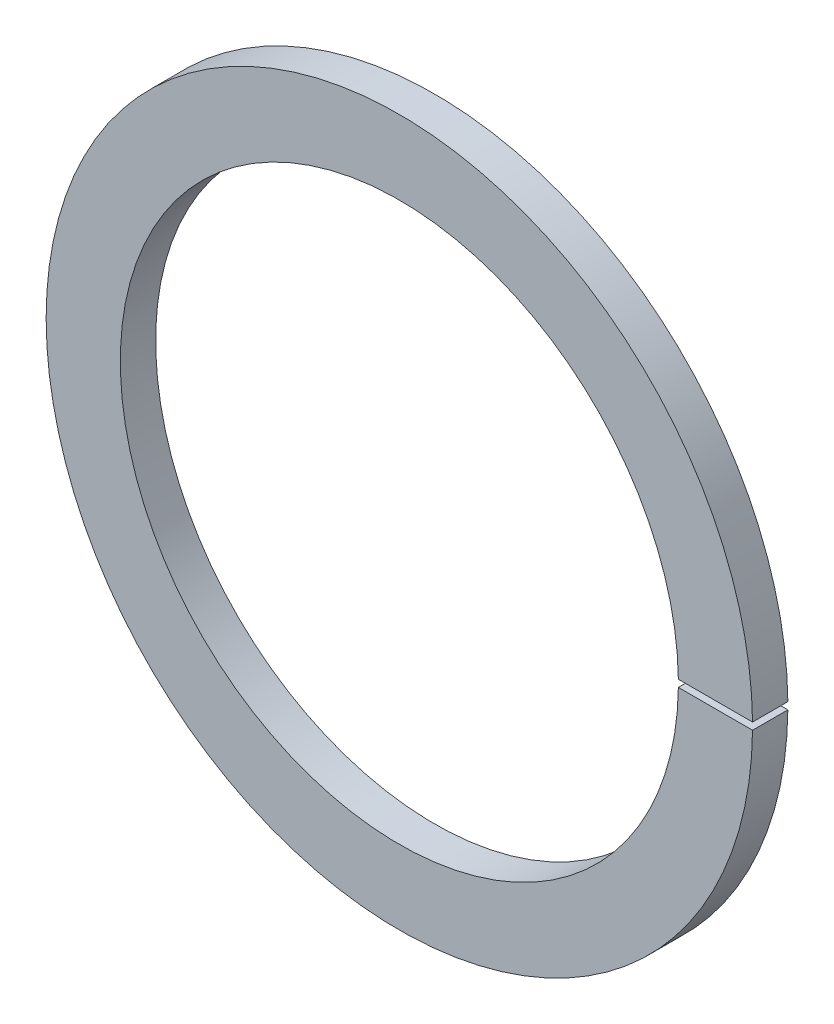
ISO-10303-21;
HEADER;
FILE_DESCRIPTION(('STEP AP214'),'2;1');
FILE_NAME('part.step','',(''),(''),'','','');
FILE_SCHEMA(('AUTOMOTIVE_DESIGN { 1 0 10303 214 1 1 1 1 }'));
ENDSEC;
DATA;
#1=APPLICATION_CONTEXT('core data for automotive mechanical design processes');
#2=APPLICATION_PROTOCOL_DEFINITION('international standard','automotive_design',2000,#1);
#3=PRODUCT_CONTEXT('',#1,'mechanical');
#4=PRODUCT('Part','Part','',(#3));
#5=PRODUCT_RELATED_PRODUCT_CATEGORY('part','',(#4));
#6=PRODUCT_DEFINITION_FORMATION('','',#4);
#7=PRODUCT_DEFINITION_CONTEXT('part definition',#1,'design');
#8=PRODUCT_DEFINITION('design','',#6,#7);
#9=PRODUCT_DEFINITION_SHAPE('','',#8);
#10=(LENGTH_UNIT() NAMED_UNIT(*) SI_UNIT(.MILLI.,.METRE.));
#11=(NAMED_UNIT(*) PLANE_ANGLE_UNIT() SI_UNIT($,.RADIAN.));
#12=(NAMED_UNIT(*) SI_UNIT($,.STERADIAN.) SOLID_ANGLE_UNIT());
#13=UNCERTAINTY_MEASURE_WITH_UNIT(LENGTH_MEASURE(1.E-05),#10,'distance_accuracy_value','');
#14=(GEOMETRIC_REPRESENTATION_CONTEXT(3) GLOBAL_UNCERTAINTY_ASSIGNED_CONTEXT((#13)) GLOBAL_UNIT_ASSIGNED_CONTEXT((#10,
#11,#12)) REPRESENTATION_CONTEXT('',''));
#15=CARTESIAN_POINT('',(0.,0.,0.));
#16=DIRECTION('',(0.,0.,1.));
#17=DIRECTION('',(1.,0.,0.));
#18=AXIS2_PLACEMENT_3D('',#15,#16,#17);
#19=CARTESIAN_POINT('',(0.,0.,1.));
#20=DIRECTION('',(0.,0.,-1.));
#21=DIRECTION('',(-1.,0.,0.));
#22=AXIS2_PLACEMENT_3D('',#19,#20,#21);
#23=CYLINDRICAL_SURFACE('',#22,10.);
#24=CARTESIAN_POINT('',(0.,0.,0.));
#25=DIRECTION('',(0.,0.,1.));
#26=DIRECTION('',(1.,0.,0.));
#27=AXIS2_PLACEMENT_3D('',#24,#25,#26);
#28=CIRCLE('',#27,10.);
#29=CARTESIAN_POINT('',(9.99949998749938,0.100000000000011,0.));
#30=VERTEX_POINT('',#29);
#31=CARTESIAN_POINT('',(9.99949998749938,-0.100000000000007,0.));
#32=VERTEX_POINT('',#31);
#33=EDGE_CURVE('E79',#30,#32,#28,.T.);
#34=ORIENTED_EDGE('',*,*,#33,.T.);
#35=DIRECTION('',(0.,0.,-1.));
#36=VECTOR('',#35,1.);
#37=CARTESIAN_POINT('',(9.99949998749938,-0.100000000000007,1.));
#38=LINE('',#37,#36);
#39=CARTESIAN_POINT('',(9.99949998749938,-0.100000000000007,1.));
#40=VERTEX_POINT('',#39);
#41=EDGE_CURVE('E11',#40,#32,#38,.T.);
#42=ORIENTED_EDGE('',*,*,#41,.F.);
#43=CARTESIAN_POINT('',(0.,0.,1.));
#44=DIRECTION('',(0.,0.,1.));
#45=DIRECTION('',(1.,0.,0.));
#46=AXIS2_PLACEMENT_3D('',#43,#44,#45);
#47=CIRCLE('',#46,10.);
#48=CARTESIAN_POINT('',(9.99949998749938,0.100000000000011,1.));
#49=VERTEX_POINT('',#48);
#50=EDGE_CURVE('E69',#49,#40,#47,.T.);
#51=ORIENTED_EDGE('',*,*,#50,.F.);
#52=DIRECTION('',(0.,0.,-1.));
#53=VECTOR('',#52,1.);
#54=CARTESIAN_POINT('',(9.99949998749938,0.100000000000011,1.));
#55=LINE('',#54,#53);
#56=EDGE_CURVE('E20',#49,#30,#55,.T.);
#57=ORIENTED_EDGE('',*,*,#56,.T.);
#58=EDGE_LOOP('',(#34,#42,#51,#57));
#59=FACE_BOUND('',#58,.T.);
#60=ADVANCED_FACE('F17',(#59),#23,.T.);
#61=CARTESIAN_POINT('',(9.99949998749938,-0.1,1.));
#62=DIRECTION('',(0.,-1.,0.));
#63=DIRECTION('',(0.,0.,-1.));
#64=AXIS2_PLACEMENT_3D('',#61,#62,#63);
#65=PLANE('',#64);
#66=DIRECTION('',(-1.,0.,0.));
#67=VECTOR('',#66,1.);
#68=CARTESIAN_POINT('',(9.99949998749938,-0.1,0.));
#69=LINE('',#68,#67);
#70=CARTESIAN_POINT('',(7.8993670632526,-0.1,0.));
#71=VERTEX_POINT('',#70);
#72=EDGE_CURVE('E50',#32,#71,#69,.T.);
#73=ORIENTED_EDGE('',*,*,#72,.T.);
#74=DIRECTION('',(0.,0.,-1.));
#75=VECTOR('',#74,1.);
#76=CARTESIAN_POINT('',(7.8993670632526,-0.1,1.));
#77=LINE('',#76,#75);
#78=CARTESIAN_POINT('',(7.8993670632526,-0.1,1.));
#79=VERTEX_POINT('',#78);
#80=EDGE_CURVE('E27',#79,#71,#77,.T.);
#81=ORIENTED_EDGE('',*,*,#80,.F.);
#82=DIRECTION('',(-1.,0.,0.));
#83=VECTOR('',#82,1.);
#84=CARTESIAN_POINT('',(9.99949998749938,-0.1,1.));
#85=LINE('',#84,#83);
#86=EDGE_CURVE('E64',#40,#79,#85,.T.);
#87=ORIENTED_EDGE('',*,*,#86,.F.);
#88=ORIENTED_EDGE('',*,*,#41,.T.);
#89=EDGE_LOOP('',(#73,#81,#87,#88));
#90=FACE_BOUND('',#89,.T.);
#91=ADVANCED_FACE('F65',(#90),#65,.F.);
#92=CARTESIAN_POINT('',(0.,0.,1.));
#93=DIRECTION('',(0.,0.,-1.));
#94=DIRECTION('',(-1.,0.,0.));
#95=AXIS2_PLACEMENT_3D('',#92,#93,#94);
#96=CYLINDRICAL_SURFACE('',#95,7.9);
#97=CARTESIAN_POINT('',(0.,0.,0.));
#98=DIRECTION('',(0.,0.,-1.));
#99=DIRECTION('',(1.,0.,0.));
#100=AXIS2_PLACEMENT_3D('',#97,#98,#99);
#101=CIRCLE('',#100,7.9);
#102=CARTESIAN_POINT('',(7.8993670632526,0.100000000000019,0.));
#103=VERTEX_POINT('',#102);
#104=EDGE_CURVE('E56',#71,#103,#101,.T.);
#105=ORIENTED_EDGE('',*,*,#104,.T.);
#106=DIRECTION('',(0.,0.,-1.));
#107=VECTOR('',#106,1.);
#108=CARTESIAN_POINT('',(7.8993670632526,0.100000000000019,1.));
#109=LINE('',#108,#107);
#110=CARTESIAN_POINT('',(7.8993670632526,0.100000000000019,1.));
#111=VERTEX_POINT('',#110);
#112=EDGE_CURVE('E96',#111,#103,#109,.T.);
#113=ORIENTED_EDGE('',*,*,#112,.F.);
#114=CARTESIAN_POINT('',(0.,0.,1.));
#115=DIRECTION('',(0.,0.,-1.));
#116=DIRECTION('',(1.,0.,0.));
#117=AXIS2_PLACEMENT_3D('',#114,#115,#116);
#118=CIRCLE('',#117,7.9);
#119=EDGE_CURVE('E35',#79,#111,#118,.T.);
#120=ORIENTED_EDGE('',*,*,#119,.F.);
#121=ORIENTED_EDGE('',*,*,#80,.T.);
#122=EDGE_LOOP('',(#105,#113,#120,#121));
#123=FACE_BOUND('',#122,.T.);
#124=ADVANCED_FACE('F101',(#123),#96,.F.);
#125=CARTESIAN_POINT('',(7.8993670632526,0.1,1.));
#126=DIRECTION('',(0.,1.,0.));
#127=DIRECTION('',(0.,0.,1.));
#128=AXIS2_PLACEMENT_3D('',#125,#126,#127);
#129=PLANE('',#128);
#130=DIRECTION('',(1.,0.,0.));
#131=VECTOR('',#130,1.);
#132=CARTESIAN_POINT('',(7.8993670632526,0.1,0.));
#133=LINE('',#132,#131);
#134=EDGE_CURVE('E76',#103,#30,#133,.T.);
#135=ORIENTED_EDGE('',*,*,#134,.T.);
#136=ORIENTED_EDGE('',*,*,#56,.F.);
#137=DIRECTION('',(1.,0.,0.));
#138=VECTOR('',#137,1.);
#139=CARTESIAN_POINT('',(7.8993670632526,0.1,1.));
#140=LINE('',#139,#138);
#141=EDGE_CURVE('E61',#111,#49,#140,.T.);
#142=ORIENTED_EDGE('',*,*,#141,.F.);
#143=ORIENTED_EDGE('',*,*,#112,.T.);
#144=EDGE_LOOP('',(#135,#136,#142,#143));
#145=FACE_BOUND('',#144,.T.);
#146=ADVANCED_FACE('F104',(#145),#129,.F.);
#147=CARTESIAN_POINT('',(0.,0.,1.));
#148=DIRECTION('',(0.,0.,1.));
#149=DIRECTION('',(1.,0.,0.));
#150=AXIS2_PLACEMENT_3D('',#147,#148,#149);
#151=PLANE('',#150);
#152=ORIENTED_EDGE('',*,*,#50,.T.);
#153=ORIENTED_EDGE('',*,*,#86,.T.);
#154=ORIENTED_EDGE('',*,*,#119,.T.);
#155=ORIENTED_EDGE('',*,*,#141,.T.);
#156=EDGE_LOOP('',(#152,#153,#154,#155));
#157=FACE_BOUND('',#156,.T.);
#158=ADVANCED_FACE('F72',(#157),#151,.T.);
#159=CARTESIAN_POINT('',(0.,0.,0.));
#160=DIRECTION('',(0.,0.,1.));
#161=DIRECTION('',(1.,0.,0.));
#162=AXIS2_PLACEMENT_3D('',#159,#160,#161);
#163=PLANE('',#162);
#164=ORIENTED_EDGE('',*,*,#33,.F.);
#165=ORIENTED_EDGE('',*,*,#134,.F.);
#166=ORIENTED_EDGE('',*,*,#104,.F.);
#167=ORIENTED_EDGE('',*,*,#72,.F.);
#168=EDGE_LOOP('',(#164,#165,#166,#167));
#169=FACE_BOUND('',#168,.T.);
#170=ADVANCED_FACE('F102',(#169),#163,.F.);
#171=CLOSED_SHELL('',(#60,#91,#124,#146,#158,#170));
#172=MANIFOLD_SOLID_BREP('B1',#171);
#173=ADVANCED_BREP_SHAPE_REPRESENTATION('',(#18,#172),#14);
#174=SHAPE_DEFINITION_REPRESENTATION(#9,#173);
ENDSEC;
END-ISO-10303-21;
